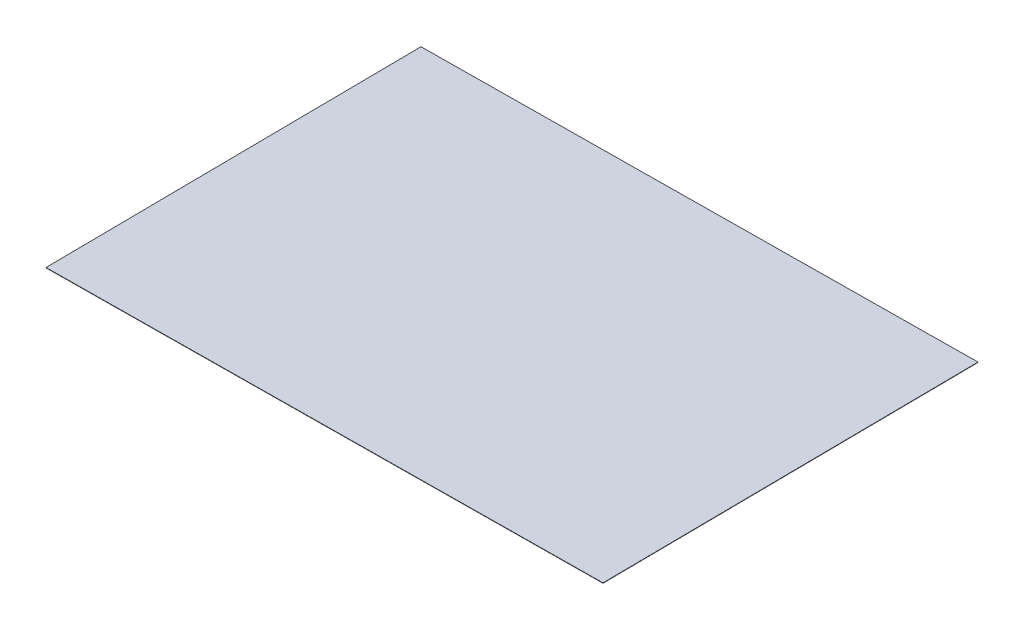
ISO-10303-21;
HEADER;
FILE_DESCRIPTION(('STEP AP214'),'2;1');
FILE_NAME('part.step','',(''),(''),'','','');
FILE_SCHEMA(('AUTOMOTIVE_DESIGN { 1 0 10303 214 1 1 1 1 }'));
ENDSEC;
DATA;
#1=APPLICATION_CONTEXT('core data for automotive mechanical design processes');
#2=APPLICATION_PROTOCOL_DEFINITION('international standard','automotive_design',2000,#1);
#3=PRODUCT_CONTEXT('',#1,'mechanical');
#4=PRODUCT('Part','Part','',(#3));
#5=PRODUCT_RELATED_PRODUCT_CATEGORY('part','',(#4));
#6=PRODUCT_DEFINITION_FORMATION('','',#4);
#7=PRODUCT_DEFINITION_CONTEXT('part definition',#1,'design');
#8=PRODUCT_DEFINITION('design','',#6,#7);
#9=PRODUCT_DEFINITION_SHAPE('','',#8);
#10=(LENGTH_UNIT() NAMED_UNIT(*) SI_UNIT(.MILLI.,.METRE.));
#11=(NAMED_UNIT(*) PLANE_ANGLE_UNIT() SI_UNIT($,.RADIAN.));
#12=(NAMED_UNIT(*) SI_UNIT($,.STERADIAN.) SOLID_ANGLE_UNIT());
#13=UNCERTAINTY_MEASURE_WITH_UNIT(LENGTH_MEASURE(1.E-05),#10,'distance_accuracy_value','');
#14=(GEOMETRIC_REPRESENTATION_CONTEXT(3) GLOBAL_UNCERTAINTY_ASSIGNED_CONTEXT((#13)) GLOBAL_UNIT_ASSIGNED_CONTEXT((#10,
#11,#12)) REPRESENTATION_CONTEXT('',''));
#15=CARTESIAN_POINT('',(0.,0.,0.));
#16=DIRECTION('',(0.,0.,1.));
#17=DIRECTION('',(1.,0.,0.));
#18=AXIS2_PLACEMENT_3D('',#15,#16,#17);
#19=CARTESIAN_POINT('',(0.,0.,0.));
#20=DIRECTION('',(0.,1.,0.));
#21=DIRECTION('',(0.,0.,1.));
#22=AXIS2_PLACEMENT_3D('',#19,#20,#21);
#23=PLANE('',#22);
#24=DIRECTION('',(-0.999952101672157,0.,0.00978745939646507));
#25=VECTOR('',#24,1.);
#26=CARTESIAN_POINT('',(-7.73848285632921,0.,-5.1278951648312));
#27=LINE('',#26,#25);
#28=CARTESIAN_POINT('',(7.53958546551762,0.,-5.27743580093411));
#29=VERTEX_POINT('',#28);
#30=CARTESIAN_POINT('',(-7.73848285632921,0.,-5.1278951648312));
#31=VERTEX_POINT('',#30);
#32=EDGE_CURVE('E89',#29,#31,#27,.T.);
#33=ORIENTED_EDGE('',*,*,#32,.F.);
#34=DIRECTION('',(0.00978745939646494,0.,0.999952101672156));
#35=VECTOR('',#34,1.);
#36=CARTESIAN_POINT('',(7.53958546551762,0.,-5.27743580093411));
#37=LINE('',#36,#35);
#38=CARTESIAN_POINT('',(7.64224506863768,0.,5.21095365116511));
#39=VERTEX_POINT('',#38);
#40=EDGE_CURVE('E76',#29,#39,#37,.T.);
#41=ORIENTED_EDGE('',*,*,#40,.T.);
#42=DIRECTION('',(0.999952101672156,0.,-0.00978745939646553));
#43=VECTOR('',#42,1.);
#44=CARTESIAN_POINT('',(7.74224506863768,0.,5.20997485834293));
#45=LINE('',#44,#43);
#46=CARTESIAN_POINT('',(-7.63582325320915,0.,5.36049428726803));
#47=VERTEX_POINT('',#46);
#48=EDGE_CURVE('E92',#47,#39,#45,.T.);
#49=ORIENTED_EDGE('',*,*,#48,.F.);
#50=DIRECTION('',(0.0097874593964651,0.,0.999952101672156));
#51=VECTOR('',#50,1.);
#52=CARTESIAN_POINT('',(-7.63582325320915,0.,5.36049428726803));
#53=LINE('',#52,#51);
#54=EDGE_CURVE('E59',#31,#47,#53,.T.);
#55=ORIENTED_EDGE('',*,*,#54,.F.);
#56=EDGE_LOOP('',(#33,#41,#49,#55));
#57=FACE_BOUND('',#56,.T.);
#58=ADVANCED_FACE('F37',(#57),#23,.F.);
#59=CARTESIAN_POINT('',(-7.63582325320915,0.,5.36049428726803));
#60=DIRECTION('',(-0.999952101672156,0.,0.0097874593964651));
#61=DIRECTION('',(0.0097874593964651,0.,0.999952101672157));
#62=AXIS2_PLACEMENT_3D('',#59,#60,#61);
#63=PLANE('',#62);
#64=DIRECTION('',(0.0097874593964651,0.,0.999952101672156));
#65=VECTOR('',#64,1.);
#66=CARTESIAN_POINT('',(-7.63582325320915,0.01,5.36049428726803));
#67=LINE('',#66,#65);
#68=CARTESIAN_POINT('',(-7.73848285632921,0.01,-5.1278951648312));
#69=VERTEX_POINT('',#68);
#70=CARTESIAN_POINT('',(-7.63582325320915,0.01,5.36049428726803));
#71=VERTEX_POINT('',#70);
#72=EDGE_CURVE('E97',#69,#71,#67,.T.);
#73=ORIENTED_EDGE('',*,*,#72,.F.);
#74=DIRECTION('',(0.,1.,0.));
#75=VECTOR('',#74,1.);
#76=CARTESIAN_POINT('',(-7.73848285632921,0.,-5.1278951648312));
#77=LINE('',#76,#75);
#78=EDGE_CURVE('E11',#31,#69,#77,.T.);
#79=ORIENTED_EDGE('',*,*,#78,.F.);
#80=ORIENTED_EDGE('',*,*,#54,.T.);
#81=DIRECTION('',(0.,1.,0.));
#82=VECTOR('',#81,1.);
#83=CARTESIAN_POINT('',(-7.63582325320915,0.,5.36049428726803));
#84=LINE('',#83,#82);
#85=EDGE_CURVE('E40',#47,#71,#84,.T.);
#86=ORIENTED_EDGE('',*,*,#85,.T.);
#87=EDGE_LOOP('',(#73,#79,#80,#86));
#88=FACE_BOUND('',#87,.T.);
#89=ADVANCED_FACE('F111',(#88),#63,.T.);
#90=CARTESIAN_POINT('',(-7.73848285632921,0.,-5.1278951648312));
#91=DIRECTION('',(-0.00978745939646507,0.,-0.999952101672156));
#92=DIRECTION('',(-0.999952101672157,0.,0.00978745939646507));
#93=AXIS2_PLACEMENT_3D('',#90,#91,#92);
#94=PLANE('',#93);
#95=DIRECTION('',(0.,1.,0.));
#96=VECTOR('',#95,1.);
#97=CARTESIAN_POINT('',(7.53958546551762,0.,-5.27743580093411));
#98=LINE('',#97,#96);
#99=CARTESIAN_POINT('',(7.53958546551762,0.01,-5.27743580093411));
#100=VERTEX_POINT('',#99);
#101=EDGE_CURVE('E51',#29,#100,#98,.T.);
#102=ORIENTED_EDGE('',*,*,#101,.F.);
#103=ORIENTED_EDGE('',*,*,#32,.T.);
#104=ORIENTED_EDGE('',*,*,#78,.T.);
#105=DIRECTION('',(-0.999952101672157,0.,0.00978745939646507));
#106=VECTOR('',#105,1.);
#107=CARTESIAN_POINT('',(-7.73848285632921,0.01,-5.1278951648312));
#108=LINE('',#107,#106);
#109=EDGE_CURVE('E90',#100,#69,#108,.T.);
#110=ORIENTED_EDGE('',*,*,#109,.F.);
#111=EDGE_LOOP('',(#102,#103,#104,#110));
#112=FACE_BOUND('',#111,.T.);
#113=ADVANCED_FACE('F88',(#112),#94,.T.);
#114=CARTESIAN_POINT('',(7.74224506863768,0.,5.20997485834293));
#115=DIRECTION('',(0.00978745939646553,0.,0.999952101672156));
#116=DIRECTION('',(0.999952101672157,0.,-0.00978745939646553));
#117=AXIS2_PLACEMENT_3D('',#114,#115,#116);
#118=PLANE('',#117);
#119=DIRECTION('',(0.,1.,0.));
#120=VECTOR('',#119,1.);
#121=CARTESIAN_POINT('',(7.64224506863768,0.,5.21095365116511));
#122=LINE('',#121,#120);
#123=CARTESIAN_POINT('',(7.64224506863768,0.01,5.21095365116511));
#124=VERTEX_POINT('',#123);
#125=EDGE_CURVE('E79',#39,#124,#122,.T.);
#126=ORIENTED_EDGE('',*,*,#125,.T.);
#127=DIRECTION('',(0.999952101672156,0.,-0.00978745939646553));
#128=VECTOR('',#127,1.);
#129=CARTESIAN_POINT('',(7.74224506863768,0.01,5.20997485834293));
#130=LINE('',#129,#128);
#131=EDGE_CURVE('E100',#71,#124,#130,.T.);
#132=ORIENTED_EDGE('',*,*,#131,.F.);
#133=ORIENTED_EDGE('',*,*,#85,.F.);
#134=ORIENTED_EDGE('',*,*,#48,.T.);
#135=EDGE_LOOP('',(#126,#132,#133,#134));
#136=FACE_BOUND('',#135,.T.);
#137=ADVANCED_FACE('F108',(#136),#118,.T.);
#138=CARTESIAN_POINT('',(0.,0.01,0.));
#139=DIRECTION('',(0.,1.,0.));
#140=DIRECTION('',(0.,0.,1.));
#141=AXIS2_PLACEMENT_3D('',#138,#139,#140);
#142=PLANE('',#141);
#143=DIRECTION('',(0.00978745939646494,0.,0.999952101672156));
#144=VECTOR('',#143,1.);
#145=CARTESIAN_POINT('',(7.53958546551762,0.01,-5.27743580093411));
#146=LINE('',#145,#144);
#147=EDGE_CURVE('E84',#100,#124,#146,.T.);
#148=ORIENTED_EDGE('',*,*,#147,.F.);
#149=ORIENTED_EDGE('',*,*,#109,.T.);
#150=ORIENTED_EDGE('',*,*,#72,.T.);
#151=ORIENTED_EDGE('',*,*,#131,.T.);
#152=EDGE_LOOP('',(#148,#149,#150,#151));
#153=FACE_BOUND('',#152,.T.);
#154=ADVANCED_FACE('F109',(#153),#142,.T.);
#155=CARTESIAN_POINT('',(7.53958546551762,0.,-5.27743580093411));
#156=DIRECTION('',(-0.999952101672156,0.,0.00978745939646494));
#157=DIRECTION('',(0.00978745939646494,0.,0.999952101672157));
#158=AXIS2_PLACEMENT_3D('',#155,#156,#157);
#159=PLANE('',#158);
#160=ORIENTED_EDGE('',*,*,#147,.T.);
#161=ORIENTED_EDGE('',*,*,#125,.F.);
#162=ORIENTED_EDGE('',*,*,#40,.F.);
#163=ORIENTED_EDGE('',*,*,#101,.T.);
#164=EDGE_LOOP('',(#160,#161,#162,#163));
#165=FACE_BOUND('',#164,.T.);
#166=ADVANCED_FACE('F77',(#165),#159,.F.);
#167=CLOSED_SHELL('',(#58,#89,#113,#137,#154,#166));
#168=MANIFOLD_SOLID_BREP('B2',#167);
#169=ADVANCED_BREP_SHAPE_REPRESENTATION('',(#18,#168),#14);
#170=SHAPE_DEFINITION_REPRESENTATION(#9,#169);
ENDSEC;
END-ISO-10303-21;
